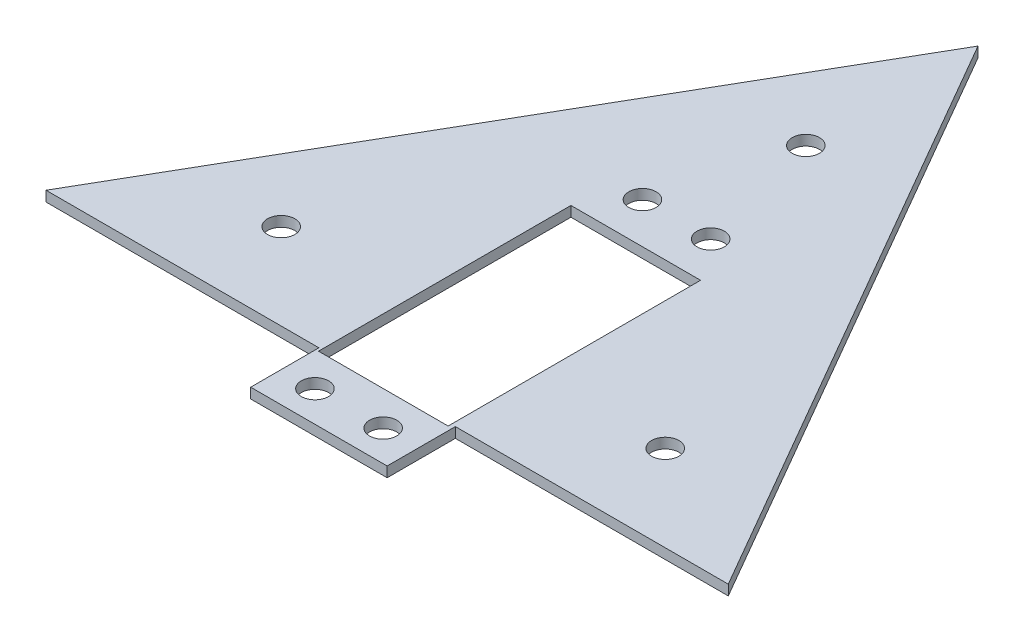
ISO-10303-21;
HEADER;
FILE_DESCRIPTION(('STEP AP214'),'2;1');
FILE_NAME('part.step','',(''),(''),'','','');
FILE_SCHEMA(('AUTOMOTIVE_DESIGN { 1 0 10303 214 1 1 1 1 }'));
ENDSEC;
DATA;
#1=APPLICATION_CONTEXT('core data for automotive mechanical design processes');
#2=APPLICATION_PROTOCOL_DEFINITION('international standard','automotive_design',2000,#1);
#3=PRODUCT_CONTEXT('',#1,'mechanical');
#4=PRODUCT('Part','Part','',(#3));
#5=PRODUCT_RELATED_PRODUCT_CATEGORY('part','',(#4));
#6=PRODUCT_DEFINITION_FORMATION('','',#4);
#7=PRODUCT_DEFINITION_CONTEXT('part definition',#1,'design');
#8=PRODUCT_DEFINITION('design','',#6,#7);
#9=PRODUCT_DEFINITION_SHAPE('','',#8);
#10=(LENGTH_UNIT() NAMED_UNIT(*) SI_UNIT(.MILLI.,.METRE.));
#11=(NAMED_UNIT(*) PLANE_ANGLE_UNIT() SI_UNIT($,.RADIAN.));
#12=(NAMED_UNIT(*) SI_UNIT($,.STERADIAN.) SOLID_ANGLE_UNIT());
#13=UNCERTAINTY_MEASURE_WITH_UNIT(LENGTH_MEASURE(1.E-05),#10,'distance_accuracy_value','');
#14=(GEOMETRIC_REPRESENTATION_CONTEXT(3) GLOBAL_UNCERTAINTY_ASSIGNED_CONTEXT((#13)) GLOBAL_UNIT_ASSIGNED_CONTEXT((#10,
#11,#12)) REPRESENTATION_CONTEXT('',''));
#15=CARTESIAN_POINT('',(0.,0.,0.));
#16=DIRECTION('',(0.,0.,1.));
#17=DIRECTION('',(1.,0.,0.));
#18=AXIS2_PLACEMENT_3D('',#15,#16,#17);
#19=CARTESIAN_POINT('',(50.0000000000004,-1.5,28.8675134594809));
#20=DIRECTION('',(0.866025403784436,0.,-0.500000000000004));
#21=DIRECTION('',(-0.500000000000004,0.,-0.866025403784436));
#22=AXIS2_PLACEMENT_3D('',#19,#20,#21);
#23=PLANE('',#22);
#24=DIRECTION('',(-0.500000000000004,0.,-0.866025403784436));
#25=VECTOR('',#24,1.);
#26=CARTESIAN_POINT('',(50.0000000000004,0.,28.8675134594809));
#27=LINE('',#26,#25);
#28=CARTESIAN_POINT('',(50.0000000000004,0.,28.8675134594809));
#29=VERTEX_POINT('',#28);
#30=CARTESIAN_POINT('',(0.,0.,-57.7350269189627));
#31=VERTEX_POINT('',#30);
#32=EDGE_CURVE('E199',#29,#31,#27,.T.);
#33=ORIENTED_EDGE('',*,*,#32,.F.);
#34=DIRECTION('',(0.,1.,0.));
#35=VECTOR('',#34,1.);
#36=CARTESIAN_POINT('',(50.0000000000004,-1.5,28.8675134594809));
#37=LINE('',#36,#35);
#38=CARTESIAN_POINT('',(50.0000000000004,-1.5,28.8675134594809));
#39=VERTEX_POINT('',#38);
#40=EDGE_CURVE('E11',#39,#29,#37,.T.);
#41=ORIENTED_EDGE('',*,*,#40,.F.);
#42=DIRECTION('',(-0.500000000000004,0.,-0.866025403784436));
#43=VECTOR('',#42,1.);
#44=CARTESIAN_POINT('',(50.0000000000004,-1.5,28.8675134594809));
#45=LINE('',#44,#43);
#46=CARTESIAN_POINT('',(0.,-1.5,-57.7350269189627));
#47=VERTEX_POINT('',#46);
#48=EDGE_CURVE('E200',#39,#47,#45,.T.);
#49=ORIENTED_EDGE('',*,*,#48,.T.);
#50=DIRECTION('',(0.,1.,0.));
#51=VECTOR('',#50,1.);
#52=CARTESIAN_POINT('',(0.,-1.5,-57.7350269189627));
#53=LINE('',#52,#51);
#54=EDGE_CURVE('E42',#47,#31,#53,.T.);
#55=ORIENTED_EDGE('',*,*,#54,.T.);
#56=EDGE_LOOP('',(#33,#41,#49,#55));
#57=FACE_BOUND('',#56,.T.);
#58=ADVANCED_FACE('F39',(#57),#23,.T.);
#59=CARTESIAN_POINT('',(10.0000000000002,-1.5,28.8675134594812));
#60=DIRECTION('',(0.,0.,1.));
#61=DIRECTION('',(1.,0.,0.));
#62=AXIS2_PLACEMENT_3D('',#59,#60,#61);
#63=PLANE('',#62);
#64=DIRECTION('',(1.,0.,0.));
#65=VECTOR('',#64,1.);
#66=CARTESIAN_POINT('',(10.0000000000002,0.,28.8675134594812));
#67=LINE('',#66,#65);
#68=CARTESIAN_POINT('',(10.0000000000002,0.,28.8675134594812));
#69=VERTEX_POINT('',#68);
#70=EDGE_CURVE('E204',#69,#29,#67,.T.);
#71=ORIENTED_EDGE('',*,*,#70,.F.);
#72=DIRECTION('',(0.,1.,0.));
#73=VECTOR('',#72,1.);
#74=CARTESIAN_POINT('',(10.0000000000002,-1.5,28.8675134594812));
#75=LINE('',#74,#73);
#76=CARTESIAN_POINT('',(10.0000000000002,-1.5,28.8675134594812));
#77=VERTEX_POINT('',#76);
#78=EDGE_CURVE('E47',#77,#69,#75,.T.);
#79=ORIENTED_EDGE('',*,*,#78,.F.);
#80=DIRECTION('',(1.,0.,0.));
#81=VECTOR('',#80,1.);
#82=CARTESIAN_POINT('',(10.0000000000002,-1.5,28.8675134594812));
#83=LINE('',#82,#81);
#84=EDGE_CURVE('E219',#77,#39,#83,.T.);
#85=ORIENTED_EDGE('',*,*,#84,.T.);
#86=ORIENTED_EDGE('',*,*,#40,.T.);
#87=EDGE_LOOP('',(#71,#79,#85,#86));
#88=FACE_BOUND('',#87,.T.);
#89=ADVANCED_FACE('F260',(#88),#63,.T.);
#90=CARTESIAN_POINT('',(10.0000000000002,-1.5,38.8675134594812));
#91=DIRECTION('',(1.,0.,0.));
#92=DIRECTION('',(0.,0.,-1.));
#93=AXIS2_PLACEMENT_3D('',#90,#91,#92);
#94=PLANE('',#93);
#95=DIRECTION('',(0.,0.,-1.));
#96=VECTOR('',#95,1.);
#97=CARTESIAN_POINT('',(10.0000000000002,0.,38.8675134594812));
#98=LINE('',#97,#96);
#99=CARTESIAN_POINT('',(10.0000000000002,0.,38.8675134594812));
#100=VERTEX_POINT('',#99);
#101=EDGE_CURVE('E236',#100,#69,#98,.T.);
#102=ORIENTED_EDGE('',*,*,#101,.F.);
#103=DIRECTION('',(0.,1.,0.));
#104=VECTOR('',#103,1.);
#105=CARTESIAN_POINT('',(10.0000000000002,-1.5,38.8675134594812));
#106=LINE('',#105,#104);
#107=CARTESIAN_POINT('',(10.0000000000002,-1.5,38.8675134594812));
#108=VERTEX_POINT('',#107);
#109=EDGE_CURVE('E242',#108,#100,#106,.T.);
#110=ORIENTED_EDGE('',*,*,#109,.F.);
#111=DIRECTION('',(0.,0.,-1.));
#112=VECTOR('',#111,1.);
#113=CARTESIAN_POINT('',(10.0000000000002,-1.5,38.8675134594812));
#114=LINE('',#113,#112);
#115=EDGE_CURVE('E216',#108,#77,#114,.T.);
#116=ORIENTED_EDGE('',*,*,#115,.T.);
#117=ORIENTED_EDGE('',*,*,#78,.T.);
#118=EDGE_LOOP('',(#102,#110,#116,#117));
#119=FACE_BOUND('',#118,.T.);
#120=ADVANCED_FACE('F277',(#119),#94,.T.);
#121=CARTESIAN_POINT('',(-9.9999999999998,-1.5,38.8675134594812));
#122=DIRECTION('',(0.,0.,1.));
#123=DIRECTION('',(1.,0.,0.));
#124=AXIS2_PLACEMENT_3D('',#121,#122,#123);
#125=PLANE('',#124);
#126=DIRECTION('',(1.,0.,0.));
#127=VECTOR('',#126,1.);
#128=CARTESIAN_POINT('',(-9.9999999999998,0.,38.8675134594812));
#129=LINE('',#128,#127);
#130=CARTESIAN_POINT('',(-9.9999999999998,0.,38.8675134594812));
#131=VERTEX_POINT('',#130);
#132=EDGE_CURVE('E233',#131,#100,#129,.T.);
#133=ORIENTED_EDGE('',*,*,#132,.F.);
#134=DIRECTION('',(0.,1.,0.));
#135=VECTOR('',#134,1.);
#136=CARTESIAN_POINT('',(-9.9999999999998,-1.5,38.8675134594812));
#137=LINE('',#136,#135);
#138=CARTESIAN_POINT('',(-9.9999999999998,-1.5,38.8675134594812));
#139=VERTEX_POINT('',#138);
#140=EDGE_CURVE('E244',#139,#131,#137,.T.);
#141=ORIENTED_EDGE('',*,*,#140,.F.);
#142=DIRECTION('',(1.,0.,0.));
#143=VECTOR('',#142,1.);
#144=CARTESIAN_POINT('',(-9.9999999999998,-1.5,38.8675134594812));
#145=LINE('',#144,#143);
#146=EDGE_CURVE('E213',#139,#108,#145,.T.);
#147=ORIENTED_EDGE('',*,*,#146,.T.);
#148=ORIENTED_EDGE('',*,*,#109,.T.);
#149=EDGE_LOOP('',(#133,#141,#147,#148));
#150=FACE_BOUND('',#149,.T.);
#151=ADVANCED_FACE('F275',(#150),#125,.T.);
#152=CARTESIAN_POINT('',(-9.9999999999998,-1.5,28.8675134594812));
#153=DIRECTION('',(-1.,0.,0.));
#154=DIRECTION('',(0.,0.,1.));
#155=AXIS2_PLACEMENT_3D('',#152,#153,#154);
#156=PLANE('',#155);
#157=DIRECTION('',(0.,0.,1.));
#158=VECTOR('',#157,1.);
#159=CARTESIAN_POINT('',(-9.9999999999998,0.,28.8675134594812));
#160=LINE('',#159,#158);
#161=CARTESIAN_POINT('',(-9.9999999999998,0.,28.8675134594812));
#162=VERTEX_POINT('',#161);
#163=EDGE_CURVE('E230',#162,#131,#160,.T.);
#164=ORIENTED_EDGE('',*,*,#163,.F.);
#165=DIRECTION('',(0.,1.,0.));
#166=VECTOR('',#165,1.);
#167=CARTESIAN_POINT('',(-9.9999999999998,-1.5,28.8675134594812));
#168=LINE('',#167,#166);
#169=CARTESIAN_POINT('',(-9.9999999999998,-1.5,28.8675134594812));
#170=VERTEX_POINT('',#169);
#171=EDGE_CURVE('E246',#170,#162,#168,.T.);
#172=ORIENTED_EDGE('',*,*,#171,.F.);
#173=DIRECTION('',(0.,0.,1.));
#174=VECTOR('',#173,1.);
#175=CARTESIAN_POINT('',(-9.9999999999998,-1.5,28.8675134594812));
#176=LINE('',#175,#174);
#177=EDGE_CURVE('E210',#170,#139,#176,.T.);
#178=ORIENTED_EDGE('',*,*,#177,.T.);
#179=ORIENTED_EDGE('',*,*,#140,.T.);
#180=EDGE_LOOP('',(#164,#172,#178,#179));
#181=FACE_BOUND('',#180,.T.);
#182=ADVANCED_FACE('F273',(#181),#156,.T.);
#183=CARTESIAN_POINT('',(-50.,-1.5,28.8675134594816));
#184=DIRECTION('',(0.,0.,1.));
#185=DIRECTION('',(1.,0.,0.));
#186=AXIS2_PLACEMENT_3D('',#183,#184,#185);
#187=PLANE('',#186);
#188=DIRECTION('',(1.,0.,0.));
#189=VECTOR('',#188,1.);
#190=CARTESIAN_POINT('',(-50.,0.,28.8675134594816));
#191=LINE('',#190,#189);
#192=CARTESIAN_POINT('',(-50.,0.,28.8675134594816));
#193=VERTEX_POINT('',#192);
#194=EDGE_CURVE('E227',#193,#162,#191,.T.);
#195=ORIENTED_EDGE('',*,*,#194,.F.);
#196=DIRECTION('',(0.,1.,0.));
#197=VECTOR('',#196,1.);
#198=CARTESIAN_POINT('',(-50.,-1.5,28.8675134594816));
#199=LINE('',#198,#197);
#200=CARTESIAN_POINT('',(-50.,-1.5,28.8675134594816));
#201=VERTEX_POINT('',#200);
#202=EDGE_CURVE('E247',#201,#193,#199,.T.);
#203=ORIENTED_EDGE('',*,*,#202,.F.);
#204=DIRECTION('',(1.,0.,0.));
#205=VECTOR('',#204,1.);
#206=CARTESIAN_POINT('',(-50.,-1.5,28.8675134594816));
#207=LINE('',#206,#205);
#208=EDGE_CURVE('E207',#201,#170,#207,.T.);
#209=ORIENTED_EDGE('',*,*,#208,.T.);
#210=ORIENTED_EDGE('',*,*,#171,.T.);
#211=EDGE_LOOP('',(#195,#203,#209,#210));
#212=FACE_BOUND('',#211,.T.);
#213=ADVANCED_FACE('F269',(#212),#187,.T.);
#214=CARTESIAN_POINT('',(0.,-1.5,-57.7350269189627));
#215=DIRECTION('',(-0.86602540378444,0.,-0.499999999999998));
#216=DIRECTION('',(-0.499999999999998,0.,0.86602540378444));
#217=AXIS2_PLACEMENT_3D('',#214,#215,#216);
#218=PLANE('',#217);
#219=DIRECTION('',(-0.499999999999998,0.,0.86602540378444));
#220=VECTOR('',#219,1.);
#221=CARTESIAN_POINT('',(0.,0.,-57.7350269189627));
#222=LINE('',#221,#220);
#223=EDGE_CURVE('E224',#31,#193,#222,.T.);
#224=ORIENTED_EDGE('',*,*,#223,.F.);
#225=ORIENTED_EDGE('',*,*,#54,.F.);
#226=DIRECTION('',(-0.499999999999998,0.,0.86602540378444));
#227=VECTOR('',#226,1.);
#228=CARTESIAN_POINT('',(0.,-1.5,-57.7350269189627));
#229=LINE('',#228,#227);
#230=EDGE_CURVE('E203',#47,#201,#229,.T.);
#231=ORIENTED_EDGE('',*,*,#230,.T.);
#232=ORIENTED_EDGE('',*,*,#202,.T.);
#233=EDGE_LOOP('',(#224,#225,#231,#232));
#234=FACE_BOUND('',#233,.T.);
#235=ADVANCED_FACE('F255',(#234),#218,.T.);
#236=CARTESIAN_POINT('',(0.,-1.5,0.));
#237=DIRECTION('',(0.,1.,0.));
#238=DIRECTION('',(0.,0.,1.));
#239=AXIS2_PLACEMENT_3D('',#236,#237,#238);
#240=PLANE('',#239);
#241=CARTESIAN_POINT('',(4.90000000000004,-1.5,-13.6524865405188));
#242=DIRECTION('',(0.,1.,0.));
#243=DIRECTION('',(0.,0.,1.));
#244=AXIS2_PLACEMENT_3D('',#241,#242,#243);
#245=CIRCLE('',#244,2.);
#246=CARTESIAN_POINT('',(4.90000000000004,-1.5,-11.6524865405188));
#247=VERTEX_POINT('',#246);
#248=EDGE_CURVE('E178',#247,#247,#245,.T.);
#249=ORIENTED_EDGE('',*,*,#248,.T.);
#250=EDGE_LOOP('',(#249));
#251=FACE_BOUND('',#250,.T.);
#252=CARTESIAN_POINT('',(-5.09999999999996,-1.5,-13.6524865405188));
#253=DIRECTION('',(0.,1.,0.));
#254=DIRECTION('',(0.,0.,1.));
#255=AXIS2_PLACEMENT_3D('',#252,#253,#254);
#256=CIRCLE('',#255,2.);
#257=CARTESIAN_POINT('',(-5.09999999999996,-1.5,-11.6524865405188));
#258=VERTEX_POINT('',#257);
#259=EDGE_CURVE('E175',#258,#258,#256,.T.);
#260=ORIENTED_EDGE('',*,*,#259,.T.);
#261=EDGE_LOOP('',(#260));
#262=FACE_BOUND('',#261,.T.);
#263=DIRECTION('',(-1.,0.,0.));
#264=VECTOR('',#263,1.);
#265=CARTESIAN_POINT('',(0.,-1.5,-7.67248654051883));
#266=LINE('',#265,#264);
#267=CARTESIAN_POINT('',(9.4000000000002,-1.5,-7.67248654051883));
#268=VERTEX_POINT('',#267);
#269=CARTESIAN_POINT('',(-9.5999999999998,-1.5,-7.67248654051883));
#270=VERTEX_POINT('',#269);
#271=EDGE_CURVE('E169',#268,#270,#266,.T.);
#272=ORIENTED_EDGE('',*,*,#271,.T.);
#273=DIRECTION('',(0.,0.,1.));
#274=VECTOR('',#273,1.);
#275=CARTESIAN_POINT('',(-9.5999999999998,-1.5,0.));
#276=LINE('',#275,#274);
#277=CARTESIAN_POINT('',(-9.59999999999979,-1.5,29.3275134594812));
#278=VERTEX_POINT('',#277);
#279=EDGE_CURVE('E172',#270,#278,#276,.T.);
#280=ORIENTED_EDGE('',*,*,#279,.T.);
#281=DIRECTION('',(1.,0.,0.));
#282=VECTOR('',#281,1.);
#283=CARTESIAN_POINT('',(0.,-1.5,29.3275134594812));
#284=LINE('',#283,#282);
#285=CARTESIAN_POINT('',(9.40000000000021,-1.5,29.3275134594812));
#286=VERTEX_POINT('',#285);
#287=EDGE_CURVE('E166',#278,#286,#284,.T.);
#288=ORIENTED_EDGE('',*,*,#287,.T.);
#289=DIRECTION('',(0.,0.,-1.));
#290=VECTOR('',#289,1.);
#291=CARTESIAN_POINT('',(9.4000000000002,-1.5,0.));
#292=LINE('',#291,#290);
#293=EDGE_CURVE('E128',#286,#268,#292,.T.);
#294=ORIENTED_EDGE('',*,*,#293,.T.);
#295=EDGE_LOOP('',(#272,#280,#288,#294));
#296=FACE_BOUND('',#295,.T.);
#297=CARTESIAN_POINT('',(4.9000000000002,-1.5,34.3475134594812));
#298=DIRECTION('',(0.,1.,0.));
#299=DIRECTION('',(0.,0.,1.));
#300=AXIS2_PLACEMENT_3D('',#297,#298,#299);
#301=CIRCLE('',#300,2.);
#302=CARTESIAN_POINT('',(4.9000000000002,-1.5,36.3475134594812));
#303=VERTEX_POINT('',#302);
#304=EDGE_CURVE('E163',#303,#303,#301,.T.);
#305=ORIENTED_EDGE('',*,*,#304,.T.);
#306=EDGE_LOOP('',(#305));
#307=FACE_BOUND('',#306,.T.);
#308=CARTESIAN_POINT('',(-5.0999999999998,-1.5,34.3475134594812));
#309=DIRECTION('',(0.,1.,0.));
#310=DIRECTION('',(0.,0.,1.));
#311=AXIS2_PLACEMENT_3D('',#308,#309,#310);
#312=CIRCLE('',#311,2.);
#313=CARTESIAN_POINT('',(-5.0999999999998,-1.5,36.3475134594812));
#314=VERTEX_POINT('',#313);
#315=EDGE_CURVE('E160',#314,#314,#312,.T.);
#316=ORIENTED_EDGE('',*,*,#315,.T.);
#317=EDGE_LOOP('',(#316));
#318=FACE_BOUND('',#317,.T.);
#319=CARTESIAN_POINT('',(0.,-1.5,-32.5));
#320=DIRECTION('',(0.,1.,0.));
#321=DIRECTION('',(0.,0.,1.));
#322=AXIS2_PLACEMENT_3D('',#319,#320,#321);
#323=CIRCLE('',#322,2.);
#324=CARTESIAN_POINT('',(0.,-1.5,-30.5));
#325=VERTEX_POINT('',#324);
#326=EDGE_CURVE('E196',#325,#325,#323,.T.);
#327=ORIENTED_EDGE('',*,*,#326,.T.);
#328=EDGE_LOOP('',(#327));
#329=FACE_BOUND('',#328,.T.);
#330=CARTESIAN_POINT('',(28.1458256229963,-1.5,16.2499999999988));
#331=DIRECTION('',(0.,1.,0.));
#332=DIRECTION('',(0.,0.,1.));
#333=AXIS2_PLACEMENT_3D('',#330,#331,#332);
#334=CIRCLE('',#333,2.0000000000018);
#335=CARTESIAN_POINT('',(28.1458256229963,-1.5,18.2500000000006));
#336=VERTEX_POINT('',#335);
#337=EDGE_CURVE('E193',#336,#336,#334,.T.);
#338=ORIENTED_EDGE('',*,*,#337,.T.);
#339=EDGE_LOOP('',(#338));
#340=FACE_BOUND('',#339,.T.);
#341=CARTESIAN_POINT('',(-28.1458256229922,-1.5,16.2500000000012));
#342=DIRECTION('',(0.,1.,0.));
#343=DIRECTION('',(0.,0.,1.));
#344=AXIS2_PLACEMENT_3D('',#341,#342,#343);
#345=CIRCLE('',#344,2.00000000000263);
#346=CARTESIAN_POINT('',(-28.1458256229922,-1.5,18.2500000000038));
#347=VERTEX_POINT('',#346);
#348=EDGE_CURVE('E185',#347,#347,#345,.T.);
#349=ORIENTED_EDGE('',*,*,#348,.T.);
#350=EDGE_LOOP('',(#349));
#351=FACE_BOUND('',#350,.T.);
#352=ORIENTED_EDGE('',*,*,#48,.F.);
#353=ORIENTED_EDGE('',*,*,#84,.F.);
#354=ORIENTED_EDGE('',*,*,#115,.F.);
#355=ORIENTED_EDGE('',*,*,#146,.F.);
#356=ORIENTED_EDGE('',*,*,#177,.F.);
#357=ORIENTED_EDGE('',*,*,#208,.F.);
#358=ORIENTED_EDGE('',*,*,#230,.F.);
#359=EDGE_LOOP('',(#352,#353,#354,#355,#356,#357,#358));
#360=FACE_BOUND('',#359,.T.);
#361=ADVANCED_FACE('F263',(#251,#262,#296,#307,#318,#329,#340,#351,#360),#240,.F.);
#362=CARTESIAN_POINT('',(0.,0.,0.));
#363=DIRECTION('',(0.,1.,0.));
#364=DIRECTION('',(0.,0.,1.));
#365=AXIS2_PLACEMENT_3D('',#362,#363,#364);
#366=PLANE('',#365);
#367=CARTESIAN_POINT('',(4.90000000000004,0.,-13.6524865405188));
#368=DIRECTION('',(0.,1.,0.));
#369=DIRECTION('',(0.,0.,1.));
#370=AXIS2_PLACEMENT_3D('',#367,#368,#369);
#371=CIRCLE('',#370,2.);
#372=CARTESIAN_POINT('',(4.90000000000004,0.,-11.6524865405188));
#373=VERTEX_POINT('',#372);
#374=EDGE_CURVE('E154',#373,#373,#371,.T.);
#375=ORIENTED_EDGE('',*,*,#374,.F.);
#376=EDGE_LOOP('',(#375));
#377=FACE_BOUND('',#376,.T.);
#378=CARTESIAN_POINT('',(-5.09999999999996,0.,-13.6524865405188));
#379=DIRECTION('',(0.,1.,0.));
#380=DIRECTION('',(0.,0.,1.));
#381=AXIS2_PLACEMENT_3D('',#378,#379,#380);
#382=CIRCLE('',#381,2.);
#383=CARTESIAN_POINT('',(-5.09999999999996,0.,-11.6524865405188));
#384=VERTEX_POINT('',#383);
#385=EDGE_CURVE('E151',#384,#384,#382,.T.);
#386=ORIENTED_EDGE('',*,*,#385,.F.);
#387=EDGE_LOOP('',(#386));
#388=FACE_BOUND('',#387,.T.);
#389=DIRECTION('',(0.,0.,1.));
#390=VECTOR('',#389,1.);
#391=CARTESIAN_POINT('',(-9.5999999999998,0.,-7.67248654051883));
#392=LINE('',#391,#390);
#393=CARTESIAN_POINT('',(-9.5999999999998,0.,-7.67248654051883));
#394=VERTEX_POINT('',#393);
#395=CARTESIAN_POINT('',(-9.59999999999979,0.,29.3275134594812));
#396=VERTEX_POINT('',#395);
#397=EDGE_CURVE('E63',#394,#396,#392,.T.);
#398=ORIENTED_EDGE('',*,*,#397,.F.);
#399=DIRECTION('',(-1.,0.,0.));
#400=VECTOR('',#399,1.);
#401=CARTESIAN_POINT('',(-9.5999999999998,0.,-7.67248654051883));
#402=LINE('',#401,#400);
#403=CARTESIAN_POINT('',(9.4000000000002,0.,-7.67248654051883));
#404=VERTEX_POINT('',#403);
#405=EDGE_CURVE('E141',#404,#394,#402,.T.);
#406=ORIENTED_EDGE('',*,*,#405,.F.);
#407=DIRECTION('',(0.,0.,-1.));
#408=VECTOR('',#407,1.);
#409=CARTESIAN_POINT('',(9.4000000000002,0.,-7.67248654051883));
#410=LINE('',#409,#408);
#411=CARTESIAN_POINT('',(9.40000000000021,0.,29.3275134594812));
#412=VERTEX_POINT('',#411);
#413=EDGE_CURVE('E125',#412,#404,#410,.T.);
#414=ORIENTED_EDGE('',*,*,#413,.F.);
#415=DIRECTION('',(1.,0.,0.));
#416=VECTOR('',#415,1.);
#417=CARTESIAN_POINT('',(-9.59999999999979,0.,29.3275134594812));
#418=LINE('',#417,#416);
#419=EDGE_CURVE('E134',#396,#412,#418,.T.);
#420=ORIENTED_EDGE('',*,*,#419,.F.);
#421=EDGE_LOOP('',(#398,#406,#414,#420));
#422=FACE_BOUND('',#421,.T.);
#423=CARTESIAN_POINT('',(4.9000000000002,0.,34.3475134594812));
#424=DIRECTION('',(0.,1.,0.));
#425=DIRECTION('',(0.,0.,1.));
#426=AXIS2_PLACEMENT_3D('',#423,#424,#425);
#427=CIRCLE('',#426,2.);
#428=CARTESIAN_POINT('',(4.9000000000002,0.,36.3475134594812));
#429=VERTEX_POINT('',#428);
#430=EDGE_CURVE('E148',#429,#429,#427,.T.);
#431=ORIENTED_EDGE('',*,*,#430,.F.);
#432=EDGE_LOOP('',(#431));
#433=FACE_BOUND('',#432,.T.);
#434=CARTESIAN_POINT('',(-5.0999999999998,0.,34.3475134594812));
#435=DIRECTION('',(0.,1.,0.));
#436=DIRECTION('',(0.,0.,1.));
#437=AXIS2_PLACEMENT_3D('',#434,#435,#436);
#438=CIRCLE('',#437,2.);
#439=CARTESIAN_POINT('',(-5.0999999999998,0.,36.3475134594812));
#440=VERTEX_POINT('',#439);
#441=EDGE_CURVE('E157',#440,#440,#438,.T.);
#442=ORIENTED_EDGE('',*,*,#441,.F.);
#443=EDGE_LOOP('',(#442));
#444=FACE_BOUND('',#443,.T.);
#445=CARTESIAN_POINT('',(0.,0.,-32.5));
#446=DIRECTION('',(0.,1.,0.));
#447=DIRECTION('',(0.,0.,1.));
#448=AXIS2_PLACEMENT_3D('',#445,#446,#447);
#449=CIRCLE('',#448,2.);
#450=CARTESIAN_POINT('',(0.,0.,-30.5));
#451=VERTEX_POINT('',#450);
#452=EDGE_CURVE('E182',#451,#451,#449,.T.);
#453=ORIENTED_EDGE('',*,*,#452,.F.);
#454=EDGE_LOOP('',(#453));
#455=FACE_BOUND('',#454,.T.);
#456=CARTESIAN_POINT('',(28.1458256229963,0.,16.2499999999988));
#457=DIRECTION('',(0.,1.,0.));
#458=DIRECTION('',(0.,0.,1.));
#459=AXIS2_PLACEMENT_3D('',#456,#457,#458);
#460=CIRCLE('',#459,2.0000000000018);
#461=CARTESIAN_POINT('',(28.1458256229963,0.,18.2500000000006));
#462=VERTEX_POINT('',#461);
#463=EDGE_CURVE('E186',#462,#462,#460,.T.);
#464=ORIENTED_EDGE('',*,*,#463,.F.);
#465=EDGE_LOOP('',(#464));
#466=FACE_BOUND('',#465,.T.);
#467=CARTESIAN_POINT('',(-28.1458256229922,0.,16.2500000000012));
#468=DIRECTION('',(0.,1.,0.));
#469=DIRECTION('',(0.,0.,1.));
#470=AXIS2_PLACEMENT_3D('',#467,#468,#469);
#471=CIRCLE('',#470,2.00000000000263);
#472=CARTESIAN_POINT('',(-28.1458256229922,0.,18.2500000000038));
#473=VERTEX_POINT('',#472);
#474=EDGE_CURVE('E181',#473,#473,#471,.T.);
#475=ORIENTED_EDGE('',*,*,#474,.F.);
#476=EDGE_LOOP('',(#475));
#477=FACE_BOUND('',#476,.T.);
#478=ORIENTED_EDGE('',*,*,#32,.T.);
#479=ORIENTED_EDGE('',*,*,#223,.T.);
#480=ORIENTED_EDGE('',*,*,#194,.T.);
#481=ORIENTED_EDGE('',*,*,#163,.T.);
#482=ORIENTED_EDGE('',*,*,#132,.T.);
#483=ORIENTED_EDGE('',*,*,#101,.T.);
#484=ORIENTED_EDGE('',*,*,#70,.T.);
#485=EDGE_LOOP('',(#478,#479,#480,#481,#482,#483,#484));
#486=FACE_BOUND('',#485,.T.);
#487=ADVANCED_FACE('F138',(#377,#388,#422,#433,#444,#455,#466,#477,#486),#366,.T.);
#488=CARTESIAN_POINT('',(-28.1458256229922,-10.,16.2500000000012));
#489=DIRECTION('',(0.,1.,0.));
#490=DIRECTION('',(0.,0.,1.));
#491=AXIS2_PLACEMENT_3D('',#488,#489,#490);
#492=CYLINDRICAL_SURFACE('',#491,2.00000000000263);
#493=ORIENTED_EDGE('',*,*,#474,.T.);
#494=EDGE_LOOP('',(#493));
#495=FACE_BOUND('',#494,.T.);
#496=ORIENTED_EDGE('',*,*,#348,.F.);
#497=EDGE_LOOP('',(#496));
#498=FACE_BOUND('',#497,.T.);
#499=ADVANCED_FACE('F339',(#495,#498),#492,.F.);
#500=CARTESIAN_POINT('',(28.1458256229963,-10.,16.2499999999988));
#501=DIRECTION('',(0.,1.,0.));
#502=DIRECTION('',(0.,0.,1.));
#503=AXIS2_PLACEMENT_3D('',#500,#501,#502);
#504=CYLINDRICAL_SURFACE('',#503,2.0000000000018);
#505=ORIENTED_EDGE('',*,*,#463,.T.);
#506=EDGE_LOOP('',(#505));
#507=FACE_BOUND('',#506,.T.);
#508=ORIENTED_EDGE('',*,*,#337,.F.);
#509=EDGE_LOOP('',(#508));
#510=FACE_BOUND('',#509,.T.);
#511=ADVANCED_FACE('F344',(#507,#510),#504,.F.);
#512=CARTESIAN_POINT('',(0.,-10.,-32.5));
#513=DIRECTION('',(0.,1.,0.));
#514=DIRECTION('',(0.,0.,1.));
#515=AXIS2_PLACEMENT_3D('',#512,#513,#514);
#516=CYLINDRICAL_SURFACE('',#515,2.);
#517=ORIENTED_EDGE('',*,*,#452,.T.);
#518=EDGE_LOOP('',(#517));
#519=FACE_BOUND('',#518,.T.);
#520=ORIENTED_EDGE('',*,*,#326,.F.);
#521=EDGE_LOOP('',(#520));
#522=FACE_BOUND('',#521,.T.);
#523=ADVANCED_FACE('F357',(#519,#522),#516,.F.);
#524=CARTESIAN_POINT('',(-5.0999999999998,-10.,34.3475134594812));
#525=DIRECTION('',(0.,1.,0.));
#526=DIRECTION('',(0.,0.,1.));
#527=AXIS2_PLACEMENT_3D('',#524,#525,#526);
#528=CYLINDRICAL_SURFACE('',#527,2.);
#529=ORIENTED_EDGE('',*,*,#441,.T.);
#530=EDGE_LOOP('',(#529));
#531=FACE_BOUND('',#530,.T.);
#532=ORIENTED_EDGE('',*,*,#315,.F.);
#533=EDGE_LOOP('',(#532));
#534=FACE_BOUND('',#533,.T.);
#535=ADVANCED_FACE('F368',(#531,#534),#528,.F.);
#536=CARTESIAN_POINT('',(4.9000000000002,-10.,34.3475134594812));
#537=DIRECTION('',(0.,1.,0.));
#538=DIRECTION('',(0.,0.,1.));
#539=AXIS2_PLACEMENT_3D('',#536,#537,#538);
#540=CYLINDRICAL_SURFACE('',#539,2.);
#541=ORIENTED_EDGE('',*,*,#430,.T.);
#542=EDGE_LOOP('',(#541));
#543=FACE_BOUND('',#542,.T.);
#544=ORIENTED_EDGE('',*,*,#304,.F.);
#545=EDGE_LOOP('',(#544));
#546=FACE_BOUND('',#545,.T.);
#547=ADVANCED_FACE('F395',(#543,#546),#540,.F.);
#548=CARTESIAN_POINT('',(-9.5999999999998,-10.,-7.67248654051883));
#549=DIRECTION('',(-1.,0.,0.));
#550=DIRECTION('',(0.,0.,1.));
#551=AXIS2_PLACEMENT_3D('',#548,#549,#550);
#552=PLANE('',#551);
#553=DIRECTION('',(0.,1.,0.));
#554=VECTOR('',#553,1.);
#555=CARTESIAN_POINT('',(-9.5999999999998,-10.,-7.67248654051883));
#556=LINE('',#555,#554);
#557=EDGE_CURVE('E146',#270,#394,#556,.T.);
#558=ORIENTED_EDGE('',*,*,#557,.T.);
#559=ORIENTED_EDGE('',*,*,#397,.T.);
#560=DIRECTION('',(0.,1.,0.));
#561=VECTOR('',#560,1.);
#562=CARTESIAN_POINT('',(-9.59999999999979,-10.,29.3275134594812));
#563=LINE('',#562,#561);
#564=EDGE_CURVE('E131',#278,#396,#563,.T.);
#565=ORIENTED_EDGE('',*,*,#564,.F.);
#566=ORIENTED_EDGE('',*,*,#279,.F.);
#567=EDGE_LOOP('',(#558,#559,#565,#566));
#568=FACE_BOUND('',#567,.T.);
#569=ADVANCED_FACE('F406',(#568),#552,.F.);
#570=CARTESIAN_POINT('',(-9.5999999999998,-10.,-7.67248654051883));
#571=DIRECTION('',(0.,0.,-1.));
#572=DIRECTION('',(-1.,0.,0.));
#573=AXIS2_PLACEMENT_3D('',#570,#571,#572);
#574=PLANE('',#573);
#575=DIRECTION('',(0.,1.,0.));
#576=VECTOR('',#575,1.);
#577=CARTESIAN_POINT('',(9.4000000000002,-10.,-7.67248654051883));
#578=LINE('',#577,#576);
#579=EDGE_CURVE('E130',#268,#404,#578,.T.);
#580=ORIENTED_EDGE('',*,*,#579,.T.);
#581=ORIENTED_EDGE('',*,*,#405,.T.);
#582=ORIENTED_EDGE('',*,*,#557,.F.);
#583=ORIENTED_EDGE('',*,*,#271,.F.);
#584=EDGE_LOOP('',(#580,#581,#582,#583));
#585=FACE_BOUND('',#584,.T.);
#586=ADVANCED_FACE('F417',(#585),#574,.F.);
#587=CARTESIAN_POINT('',(9.4000000000002,-10.,-7.67248654051883));
#588=DIRECTION('',(1.,0.,0.));
#589=DIRECTION('',(0.,0.,-1.));
#590=AXIS2_PLACEMENT_3D('',#587,#588,#589);
#591=PLANE('',#590);
#592=DIRECTION('',(0.,1.,0.));
#593=VECTOR('',#592,1.);
#594=CARTESIAN_POINT('',(9.40000000000021,-10.,29.3275134594812));
#595=LINE('',#594,#593);
#596=EDGE_CURVE('E55',#286,#412,#595,.T.);
#597=ORIENTED_EDGE('',*,*,#596,.T.);
#598=ORIENTED_EDGE('',*,*,#413,.T.);
#599=ORIENTED_EDGE('',*,*,#579,.F.);
#600=ORIENTED_EDGE('',*,*,#293,.F.);
#601=EDGE_LOOP('',(#597,#598,#599,#600));
#602=FACE_BOUND('',#601,.T.);
#603=ADVANCED_FACE('F122',(#602),#591,.F.);
#604=CARTESIAN_POINT('',(-9.59999999999979,-10.,29.3275134594812));
#605=DIRECTION('',(0.,0.,1.));
#606=DIRECTION('',(1.,0.,0.));
#607=AXIS2_PLACEMENT_3D('',#604,#605,#606);
#608=PLANE('',#607);
#609=ORIENTED_EDGE('',*,*,#564,.T.);
#610=ORIENTED_EDGE('',*,*,#419,.T.);
#611=ORIENTED_EDGE('',*,*,#596,.F.);
#612=ORIENTED_EDGE('',*,*,#287,.F.);
#613=EDGE_LOOP('',(#609,#610,#611,#612));
#614=FACE_BOUND('',#613,.T.);
#615=ADVANCED_FACE('F135',(#614),#608,.F.);
#616=CARTESIAN_POINT('',(-5.09999999999996,-10.,-13.6524865405188));
#617=DIRECTION('',(0.,1.,0.));
#618=DIRECTION('',(0.,0.,1.));
#619=AXIS2_PLACEMENT_3D('',#616,#617,#618);
#620=CYLINDRICAL_SURFACE('',#619,2.);
#621=ORIENTED_EDGE('',*,*,#385,.T.);
#622=EDGE_LOOP('',(#621));
#623=FACE_BOUND('',#622,.T.);
#624=ORIENTED_EDGE('',*,*,#259,.F.);
#625=EDGE_LOOP('',(#624));
#626=FACE_BOUND('',#625,.T.);
#627=ADVANCED_FACE('F446',(#623,#626),#620,.F.);
#628=CARTESIAN_POINT('',(4.90000000000004,-10.,-13.6524865405188));
#629=DIRECTION('',(0.,1.,0.));
#630=DIRECTION('',(0.,0.,1.));
#631=AXIS2_PLACEMENT_3D('',#628,#629,#630);
#632=CYLINDRICAL_SURFACE('',#631,2.);
#633=ORIENTED_EDGE('',*,*,#374,.T.);
#634=EDGE_LOOP('',(#633));
#635=FACE_BOUND('',#634,.T.);
#636=ORIENTED_EDGE('',*,*,#248,.F.);
#637=EDGE_LOOP('',(#636));
#638=FACE_BOUND('',#637,.T.);
#639=ADVANCED_FACE('F456',(#635,#638),#632,.F.);
#640=CLOSED_SHELL('',(#58,#89,#120,#151,#182,#213,#235,#361,#487,#499,#511,#523,#535,#547,#569,
#586,#603,#615,#627,#639));
#641=MANIFOLD_SOLID_BREP('B2',#640);
#642=ADVANCED_BREP_SHAPE_REPRESENTATION('',(#18,#641),#14);
#643=SHAPE_DEFINITION_REPRESENTATION(#9,#642);
ENDSEC;
END-ISO-10303-21;
